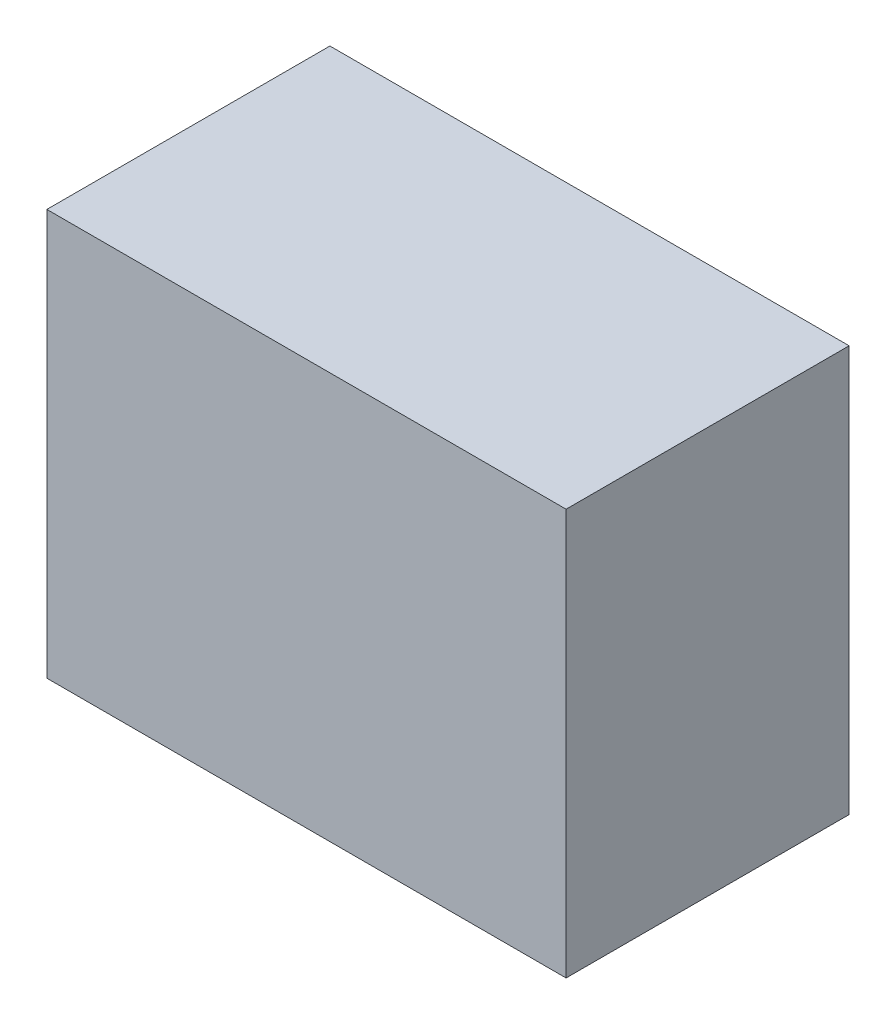
ISO-10303-21;
HEADER;
FILE_DESCRIPTION(('STEP AP214'),'2;1');
FILE_NAME('part.step','',(''),(''),'','','');
FILE_SCHEMA(('AUTOMOTIVE_DESIGN { 1 0 10303 214 1 1 1 1 }'));
ENDSEC;
DATA;
#1=APPLICATION_CONTEXT('core data for automotive mechanical design processes');
#2=APPLICATION_PROTOCOL_DEFINITION('international standard','automotive_design',2000,#1);
#3=PRODUCT_CONTEXT('',#1,'mechanical');
#4=PRODUCT('Part','Part','',(#3));
#5=PRODUCT_RELATED_PRODUCT_CATEGORY('part','',(#4));
#6=PRODUCT_DEFINITION_FORMATION('','',#4);
#7=PRODUCT_DEFINITION_CONTEXT('part definition',#1,'design');
#8=PRODUCT_DEFINITION('design','',#6,#7);
#9=PRODUCT_DEFINITION_SHAPE('','',#8);
#10=(LENGTH_UNIT() NAMED_UNIT(*) SI_UNIT(.MILLI.,.METRE.));
#11=(NAMED_UNIT(*) PLANE_ANGLE_UNIT() SI_UNIT($,.RADIAN.));
#12=(NAMED_UNIT(*) SI_UNIT($,.STERADIAN.) SOLID_ANGLE_UNIT());
#13=UNCERTAINTY_MEASURE_WITH_UNIT(LENGTH_MEASURE(1.E-05),#10,'distance_accuracy_value','');
#14=(GEOMETRIC_REPRESENTATION_CONTEXT(3) GLOBAL_UNCERTAINTY_ASSIGNED_CONTEXT((#13)) GLOBAL_UNIT_ASSIGNED_CONTEXT((#10,
#11,#12)) REPRESENTATION_CONTEXT('',''));
#15=CARTESIAN_POINT('',(0.,0.,0.));
#16=DIRECTION('',(0.,0.,1.));
#17=DIRECTION('',(1.,0.,0.));
#18=AXIS2_PLACEMENT_3D('',#15,#16,#17);
#19=CARTESIAN_POINT('',(0.,0.,14.5));
#20=DIRECTION('',(1.,0.,0.));
#21=DIRECTION('',(0.,0.,-1.));
#22=AXIS2_PLACEMENT_3D('',#19,#20,#21);
#23=PLANE('',#22);
#24=DIRECTION('',(0.,-1.,0.));
#25=VECTOR('',#24,1.);
#26=CARTESIAN_POINT('',(0.,0.,0.));
#27=LINE('',#26,#25);
#28=CARTESIAN_POINT('',(0.,20.8,0.));
#29=VERTEX_POINT('',#28);
#30=CARTESIAN_POINT('',(0.,0.,0.));
#31=VERTEX_POINT('',#30);
#32=EDGE_CURVE('E107',#29,#31,#27,.T.);
#33=ORIENTED_EDGE('',*,*,#32,.T.);
#34=DIRECTION('',(0.,0.,-1.));
#35=VECTOR('',#34,1.);
#36=CARTESIAN_POINT('',(0.,0.,14.5));
#37=LINE('',#36,#35);
#38=CARTESIAN_POINT('',(0.,0.,14.5));
#39=VERTEX_POINT('',#38);
#40=EDGE_CURVE('E11',#39,#31,#37,.T.);
#41=ORIENTED_EDGE('',*,*,#40,.F.);
#42=DIRECTION('',(0.,-1.,0.));
#43=VECTOR('',#42,1.);
#44=CARTESIAN_POINT('',(0.,0.,14.5));
#45=LINE('',#44,#43);
#46=CARTESIAN_POINT('',(0.,20.8,14.5));
#47=VERTEX_POINT('',#46);
#48=EDGE_CURVE('E91',#47,#39,#45,.T.);
#49=ORIENTED_EDGE('',*,*,#48,.F.);
#50=DIRECTION('',(0.,0.,-1.));
#51=VECTOR('',#50,1.);
#52=CARTESIAN_POINT('',(0.,20.8,14.5));
#53=LINE('',#52,#51);
#54=EDGE_CURVE('E103',#47,#29,#53,.T.);
#55=ORIENTED_EDGE('',*,*,#54,.T.);
#56=EDGE_LOOP('',(#33,#41,#49,#55));
#57=FACE_BOUND('',#56,.T.);
#58=ADVANCED_FACE('F39',(#57),#23,.F.);
#59=CARTESIAN_POINT('',(0.,0.,14.5));
#60=DIRECTION('',(0.,1.,0.));
#61=DIRECTION('',(0.,0.,1.));
#62=AXIS2_PLACEMENT_3D('',#59,#60,#61);
#63=PLANE('',#62);
#64=DIRECTION('',(1.,0.,0.));
#65=VECTOR('',#64,1.);
#66=CARTESIAN_POINT('',(0.,0.,0.));
#67=LINE('',#66,#65);
#68=CARTESIAN_POINT('',(26.6,0.,0.));
#69=VERTEX_POINT('',#68);
#70=EDGE_CURVE('E96',#31,#69,#67,.T.);
#71=ORIENTED_EDGE('',*,*,#70,.T.);
#72=DIRECTION('',(0.,0.,-1.));
#73=VECTOR('',#72,1.);
#74=CARTESIAN_POINT('',(26.6,0.,14.5));
#75=LINE('',#74,#73);
#76=CARTESIAN_POINT('',(26.6,0.,14.5));
#77=VERTEX_POINT('',#76);
#78=EDGE_CURVE('E48',#77,#69,#75,.T.);
#79=ORIENTED_EDGE('',*,*,#78,.F.);
#80=DIRECTION('',(1.,0.,0.));
#81=VECTOR('',#80,1.);
#82=CARTESIAN_POINT('',(0.,0.,14.5));
#83=LINE('',#82,#81);
#84=EDGE_CURVE('E86',#39,#77,#83,.T.);
#85=ORIENTED_EDGE('',*,*,#84,.F.);
#86=ORIENTED_EDGE('',*,*,#40,.T.);
#87=EDGE_LOOP('',(#71,#79,#85,#86));
#88=FACE_BOUND('',#87,.T.);
#89=ADVANCED_FACE('F95',(#88),#63,.F.);
#90=CARTESIAN_POINT('',(26.6,0.,14.5));
#91=DIRECTION('',(-1.,0.,0.));
#92=DIRECTION('',(0.,0.,1.));
#93=AXIS2_PLACEMENT_3D('',#90,#91,#92);
#94=PLANE('',#93);
#95=DIRECTION('',(0.,1.,0.));
#96=VECTOR('',#95,1.);
#97=CARTESIAN_POINT('',(26.6,0.,0.));
#98=LINE('',#97,#96);
#99=CARTESIAN_POINT('',(26.6,20.8,0.));
#100=VERTEX_POINT('',#99);
#101=EDGE_CURVE('E73',#69,#100,#98,.T.);
#102=ORIENTED_EDGE('',*,*,#101,.T.);
#103=DIRECTION('',(0.,0.,-1.));
#104=VECTOR('',#103,1.);
#105=CARTESIAN_POINT('',(26.6,20.8,14.5));
#106=LINE('',#105,#104);
#107=CARTESIAN_POINT('',(26.6,20.8,14.5));
#108=VERTEX_POINT('',#107);
#109=EDGE_CURVE('E98',#108,#100,#106,.T.);
#110=ORIENTED_EDGE('',*,*,#109,.F.);
#111=DIRECTION('',(0.,1.,0.));
#112=VECTOR('',#111,1.);
#113=CARTESIAN_POINT('',(26.6,0.,14.5));
#114=LINE('',#113,#112);
#115=EDGE_CURVE('E89',#77,#108,#114,.T.);
#116=ORIENTED_EDGE('',*,*,#115,.F.);
#117=ORIENTED_EDGE('',*,*,#78,.T.);
#118=EDGE_LOOP('',(#102,#110,#116,#117));
#119=FACE_BOUND('',#118,.T.);
#120=ADVANCED_FACE('F99',(#119),#94,.F.);
#121=CARTESIAN_POINT('',(0.,20.8,14.5));
#122=DIRECTION('',(0.,-1.,0.));
#123=DIRECTION('',(0.,0.,-1.));
#124=AXIS2_PLACEMENT_3D('',#121,#122,#123);
#125=PLANE('',#124);
#126=DIRECTION('',(-1.,0.,0.));
#127=VECTOR('',#126,1.);
#128=CARTESIAN_POINT('',(0.,20.8,0.));
#129=LINE('',#128,#127);
#130=EDGE_CURVE('E79',#100,#29,#129,.T.);
#131=ORIENTED_EDGE('',*,*,#130,.T.);
#132=ORIENTED_EDGE('',*,*,#54,.F.);
#133=DIRECTION('',(-1.,0.,0.));
#134=VECTOR('',#133,1.);
#135=CARTESIAN_POINT('',(0.,20.8,14.5));
#136=LINE('',#135,#134);
#137=EDGE_CURVE('E56',#108,#47,#136,.T.);
#138=ORIENTED_EDGE('',*,*,#137,.F.);
#139=ORIENTED_EDGE('',*,*,#109,.T.);
#140=EDGE_LOOP('',(#131,#132,#138,#139));
#141=FACE_BOUND('',#140,.T.);
#142=ADVANCED_FACE('F120',(#141),#125,.F.);
#143=CARTESIAN_POINT('',(0.,0.,14.5));
#144=DIRECTION('',(0.,0.,-1.));
#145=DIRECTION('',(-1.,0.,0.));
#146=AXIS2_PLACEMENT_3D('',#143,#144,#145);
#147=PLANE('',#146);
#148=ORIENTED_EDGE('',*,*,#48,.T.);
#149=ORIENTED_EDGE('',*,*,#84,.T.);
#150=ORIENTED_EDGE('',*,*,#115,.T.);
#151=ORIENTED_EDGE('',*,*,#137,.T.);
#152=EDGE_LOOP('',(#148,#149,#150,#151));
#153=FACE_BOUND('',#152,.T.);
#154=ADVANCED_FACE('F87',(#153),#147,.F.);
#155=CARTESIAN_POINT('',(0.,0.,0.));
#156=DIRECTION('',(0.,0.,-1.));
#157=DIRECTION('',(-1.,0.,0.));
#158=AXIS2_PLACEMENT_3D('',#155,#156,#157);
#159=PLANE('',#158);
#160=ORIENTED_EDGE('',*,*,#32,.F.);
#161=ORIENTED_EDGE('',*,*,#130,.F.);
#162=ORIENTED_EDGE('',*,*,#101,.F.);
#163=ORIENTED_EDGE('',*,*,#70,.F.);
#164=EDGE_LOOP('',(#160,#161,#162,#163));
#165=FACE_BOUND('',#164,.T.);
#166=ADVANCED_FACE('F123',(#165),#159,.T.);
#167=CLOSED_SHELL('',(#58,#89,#120,#142,#154,#166));
#168=MANIFOLD_SOLID_BREP('B2',#167);
#169=ADVANCED_BREP_SHAPE_REPRESENTATION('',(#18,#168),#14);
#170=SHAPE_DEFINITION_REPRESENTATION(#9,#169);
ENDSEC;
END-ISO-10303-21;
